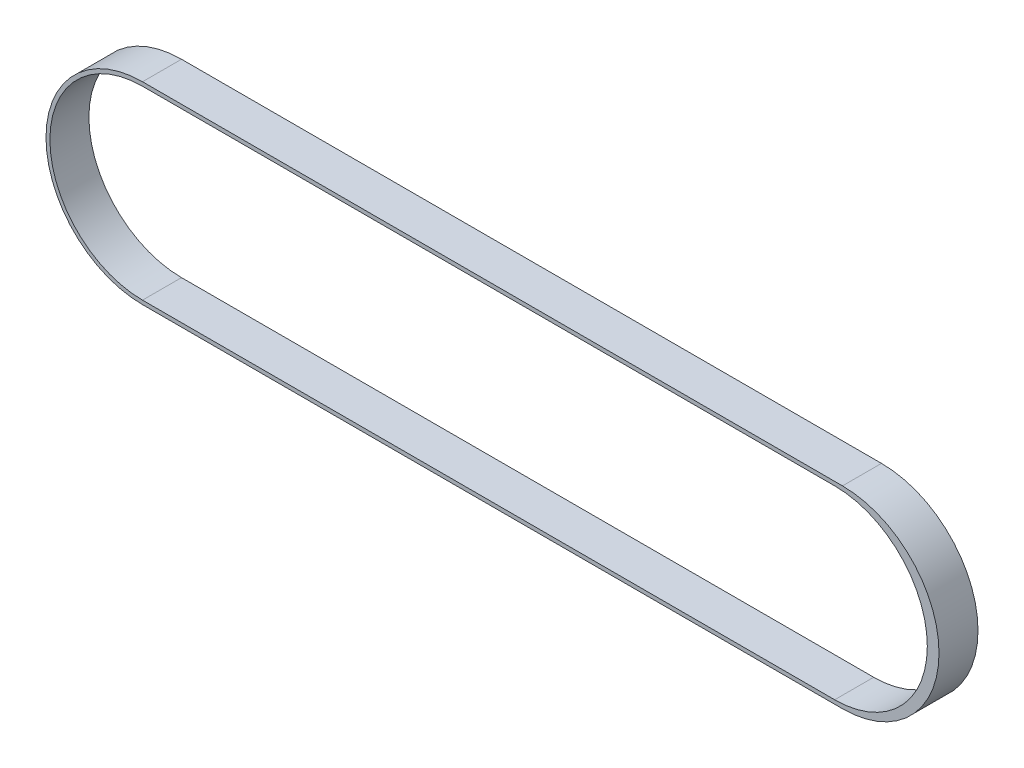
ISO-10303-21;
HEADER;
FILE_DESCRIPTION(('STEP AP214'),'2;1');
FILE_NAME('part.step','',(''),(''),'','','');
FILE_SCHEMA(('AUTOMOTIVE_DESIGN { 1 0 10303 214 1 1 1 1 }'));
ENDSEC;
DATA;
#1=APPLICATION_CONTEXT('core data for automotive mechanical design processes');
#2=APPLICATION_PROTOCOL_DEFINITION('international standard','automotive_design',2000,#1);
#3=PRODUCT_CONTEXT('',#1,'mechanical');
#4=PRODUCT('Part','Part','',(#3));
#5=PRODUCT_RELATED_PRODUCT_CATEGORY('part','',(#4));
#6=PRODUCT_DEFINITION_FORMATION('','',#4);
#7=PRODUCT_DEFINITION_CONTEXT('part definition',#1,'design');
#8=PRODUCT_DEFINITION('design','',#6,#7);
#9=PRODUCT_DEFINITION_SHAPE('','',#8);
#10=(LENGTH_UNIT() NAMED_UNIT(*) SI_UNIT(.MILLI.,.METRE.));
#11=(NAMED_UNIT(*) PLANE_ANGLE_UNIT() SI_UNIT($,.RADIAN.));
#12=(NAMED_UNIT(*) SI_UNIT($,.STERADIAN.) SOLID_ANGLE_UNIT());
#13=UNCERTAINTY_MEASURE_WITH_UNIT(LENGTH_MEASURE(1.E-05),#10,'distance_accuracy_value','');
#14=(GEOMETRIC_REPRESENTATION_CONTEXT(3) GLOBAL_UNCERTAINTY_ASSIGNED_CONTEXT((#13)) GLOBAL_UNIT_ASSIGNED_CONTEXT((#10,
#11,#12)) REPRESENTATION_CONTEXT('',''));
#15=CARTESIAN_POINT('',(0.,0.,0.));
#16=DIRECTION('',(0.,0.,1.));
#17=DIRECTION('',(1.,0.,0.));
#18=AXIS2_PLACEMENT_3D('',#15,#16,#17);
#19=CARTESIAN_POINT('',(0.,0.,12.7));
#20=DIRECTION('',(0.,0.,-1.));
#21=DIRECTION('',(-1.,0.,0.));
#22=AXIS2_PLACEMENT_3D('',#19,#20,#21);
#23=CYLINDRICAL_SURFACE('',#22,31.4325);
#24=CARTESIAN_POINT('',(0.,0.,0.));
#25=DIRECTION('',(0.,0.,1.));
#26=DIRECTION('',(1.,0.,0.));
#27=AXIS2_PLACEMENT_3D('',#24,#25,#26);
#28=CIRCLE('',#27,31.4325);
#29=CARTESIAN_POINT('',(0.,31.4325,0.));
#30=VERTEX_POINT('',#29);
#31=CARTESIAN_POINT('',(0.,-31.4325,0.));
#32=VERTEX_POINT('',#31);
#33=EDGE_CURVE('E147',#30,#32,#28,.T.);
#34=ORIENTED_EDGE('',*,*,#33,.T.);
#35=DIRECTION('',(0.,0.,-1.));
#36=VECTOR('',#35,1.);
#37=CARTESIAN_POINT('',(0.,-31.4325,12.7));
#38=LINE('',#37,#36);
#39=CARTESIAN_POINT('',(0.,-31.4325,12.7));
#40=VERTEX_POINT('',#39);
#41=EDGE_CURVE('E11',#40,#32,#38,.T.);
#42=ORIENTED_EDGE('',*,*,#41,.F.);
#43=CARTESIAN_POINT('',(0.,0.,12.7));
#44=DIRECTION('',(0.,0.,1.));
#45=DIRECTION('',(1.,0.,0.));
#46=AXIS2_PLACEMENT_3D('',#43,#44,#45);
#47=CIRCLE('',#46,31.4325);
#48=CARTESIAN_POINT('',(0.,31.4325,12.7));
#49=VERTEX_POINT('',#48);
#50=EDGE_CURVE('E153',#49,#40,#47,.T.);
#51=ORIENTED_EDGE('',*,*,#50,.F.);
#52=DIRECTION('',(0.,0.,-1.));
#53=VECTOR('',#52,1.);
#54=CARTESIAN_POINT('',(0.,31.4325,12.7));
#55=LINE('',#54,#53);
#56=EDGE_CURVE('E167',#49,#30,#55,.T.);
#57=ORIENTED_EDGE('',*,*,#56,.T.);
#58=EDGE_LOOP('',(#34,#42,#51,#57));
#59=FACE_BOUND('',#58,.T.);
#60=ADVANCED_FACE('F39',(#59),#23,.T.);
#61=CARTESIAN_POINT('',(0.,-31.4325,12.7));
#62=DIRECTION('',(0.,1.,0.));
#63=DIRECTION('',(0.,0.,1.));
#64=AXIS2_PLACEMENT_3D('',#61,#62,#63);
#65=PLANE('',#64);
#66=DIRECTION('',(1.,0.,0.));
#67=VECTOR('',#66,1.);
#68=CARTESIAN_POINT('',(0.,-31.4325,0.));
#69=LINE('',#68,#67);
#70=CARTESIAN_POINT('',(227.965,-31.4325,0.));
#71=VERTEX_POINT('',#70);
#72=EDGE_CURVE('E171',#32,#71,#69,.T.);
#73=ORIENTED_EDGE('',*,*,#72,.T.);
#74=DIRECTION('',(0.,0.,-1.));
#75=VECTOR('',#74,1.);
#76=CARTESIAN_POINT('',(227.965,-31.4325,12.7));
#77=LINE('',#76,#75);
#78=CARTESIAN_POINT('',(227.965,-31.4325,12.7));
#79=VERTEX_POINT('',#78);
#80=EDGE_CURVE('E47',#79,#71,#77,.T.);
#81=ORIENTED_EDGE('',*,*,#80,.F.);
#82=DIRECTION('',(1.,0.,0.));
#83=VECTOR('',#82,1.);
#84=CARTESIAN_POINT('',(0.,-31.4325,12.7));
#85=LINE('',#84,#83);
#86=EDGE_CURVE('E157',#40,#79,#85,.T.);
#87=ORIENTED_EDGE('',*,*,#86,.F.);
#88=ORIENTED_EDGE('',*,*,#41,.T.);
#89=EDGE_LOOP('',(#73,#81,#87,#88));
#90=FACE_BOUND('',#89,.T.);
#91=ADVANCED_FACE('F205',(#90),#65,.F.);
#92=CARTESIAN_POINT('',(227.965,0.,12.7));
#93=DIRECTION('',(0.,0.,-1.));
#94=DIRECTION('',(-1.,0.,0.));
#95=AXIS2_PLACEMENT_3D('',#92,#93,#94);
#96=CYLINDRICAL_SURFACE('',#95,31.4325);
#97=CARTESIAN_POINT('',(227.965,0.,0.));
#98=DIRECTION('',(0.,0.,1.));
#99=DIRECTION('',(1.,0.,0.));
#100=AXIS2_PLACEMENT_3D('',#97,#98,#99);
#101=CIRCLE('',#100,31.4325);
#102=CARTESIAN_POINT('',(227.965,31.4325,0.));
#103=VERTEX_POINT('',#102);
#104=EDGE_CURVE('E174',#71,#103,#101,.T.);
#105=ORIENTED_EDGE('',*,*,#104,.T.);
#106=DIRECTION('',(0.,0.,-1.));
#107=VECTOR('',#106,1.);
#108=CARTESIAN_POINT('',(227.965,31.4325,12.7));
#109=LINE('',#108,#107);
#110=CARTESIAN_POINT('',(227.965,31.4325,12.7));
#111=VERTEX_POINT('',#110);
#112=EDGE_CURVE('E182',#111,#103,#109,.T.);
#113=ORIENTED_EDGE('',*,*,#112,.F.);
#114=CARTESIAN_POINT('',(227.965,0.,12.7));
#115=DIRECTION('',(0.,0.,1.));
#116=DIRECTION('',(1.,0.,0.));
#117=AXIS2_PLACEMENT_3D('',#114,#115,#116);
#118=CIRCLE('',#117,31.4325);
#119=EDGE_CURVE('E161',#79,#111,#118,.T.);
#120=ORIENTED_EDGE('',*,*,#119,.F.);
#121=ORIENTED_EDGE('',*,*,#80,.T.);
#122=EDGE_LOOP('',(#105,#113,#120,#121));
#123=FACE_BOUND('',#122,.T.);
#124=ADVANCED_FACE('F191',(#123),#96,.T.);
#125=CARTESIAN_POINT('',(0.,31.4325,12.7));
#126=DIRECTION('',(0.,-1.,0.));
#127=DIRECTION('',(0.,0.,-1.));
#128=AXIS2_PLACEMENT_3D('',#125,#126,#127);
#129=PLANE('',#128);
#130=DIRECTION('',(-1.,0.,0.));
#131=VECTOR('',#130,1.);
#132=CARTESIAN_POINT('',(0.,31.4325,0.));
#133=LINE('',#132,#131);
#134=EDGE_CURVE('E158',#103,#30,#133,.T.);
#135=ORIENTED_EDGE('',*,*,#134,.T.);
#136=ORIENTED_EDGE('',*,*,#56,.F.);
#137=DIRECTION('',(-1.,0.,0.));
#138=VECTOR('',#137,1.);
#139=CARTESIAN_POINT('',(0.,31.4325,12.7));
#140=LINE('',#139,#138);
#141=EDGE_CURVE('E164',#111,#49,#140,.T.);
#142=ORIENTED_EDGE('',*,*,#141,.F.);
#143=ORIENTED_EDGE('',*,*,#112,.T.);
#144=EDGE_LOOP('',(#135,#136,#142,#143));
#145=FACE_BOUND('',#144,.T.);
#146=ADVANCED_FACE('F198',(#145),#129,.F.);
#147=CARTESIAN_POINT('',(0.,0.,12.7));
#148=DIRECTION('',(0.,0.,1.));
#149=DIRECTION('',(1.,0.,0.));
#150=AXIS2_PLACEMENT_3D('',#147,#148,#149);
#151=PLANE('',#150);
#152=CARTESIAN_POINT('',(0.,0.,12.7));
#153=DIRECTION('',(0.,0.,1.));
#154=DIRECTION('',(1.,0.,0.));
#155=AXIS2_PLACEMENT_3D('',#152,#153,#154);
#156=CIRCLE('',#155,30.1625);
#157=CARTESIAN_POINT('',(0.,30.1625,12.7));
#158=VERTEX_POINT('',#157);
#159=CARTESIAN_POINT('',(0.,-30.1625,12.7));
#160=VERTEX_POINT('',#159);
#161=EDGE_CURVE('E54',#158,#160,#156,.T.);
#162=ORIENTED_EDGE('',*,*,#161,.F.);
#163=DIRECTION('',(-1.,0.,0.));
#164=VECTOR('',#163,1.);
#165=CARTESIAN_POINT('',(0.,30.1625,12.7));
#166=LINE('',#165,#164);
#167=CARTESIAN_POINT('',(225.425,30.1625,12.7));
#168=VERTEX_POINT('',#167);
#169=EDGE_CURVE('E125',#168,#158,#166,.T.);
#170=ORIENTED_EDGE('',*,*,#169,.F.);
#171=CARTESIAN_POINT('',(225.425,0.,12.7));
#172=DIRECTION('',(0.,0.,1.));
#173=DIRECTION('',(1.,0.,0.));
#174=AXIS2_PLACEMENT_3D('',#171,#172,#173);
#175=CIRCLE('',#174,30.1625);
#176=CARTESIAN_POINT('',(225.425,-30.1625,12.7));
#177=VERTEX_POINT('',#176);
#178=EDGE_CURVE('E129',#177,#168,#175,.T.);
#179=ORIENTED_EDGE('',*,*,#178,.F.);
#180=DIRECTION('',(1.,0.,0.));
#181=VECTOR('',#180,1.);
#182=CARTESIAN_POINT('',(0.,-30.1625,12.7));
#183=LINE('',#182,#181);
#184=EDGE_CURVE('E138',#160,#177,#183,.T.);
#185=ORIENTED_EDGE('',*,*,#184,.F.);
#186=EDGE_LOOP('',(#162,#170,#179,#185));
#187=FACE_BOUND('',#186,.T.);
#188=ORIENTED_EDGE('',*,*,#50,.T.);
#189=ORIENTED_EDGE('',*,*,#86,.T.);
#190=ORIENTED_EDGE('',*,*,#119,.T.);
#191=ORIENTED_EDGE('',*,*,#141,.T.);
#192=EDGE_LOOP('',(#188,#189,#190,#191));
#193=FACE_BOUND('',#192,.T.);
#194=ADVANCED_FACE('F204',(#187,#193),#151,.T.);
#195=CARTESIAN_POINT('',(0.,0.,0.));
#196=DIRECTION('',(0.,0.,1.));
#197=DIRECTION('',(1.,0.,0.));
#198=AXIS2_PLACEMENT_3D('',#195,#196,#197);
#199=PLANE('',#198);
#200=DIRECTION('',(-1.,0.,0.));
#201=VECTOR('',#200,1.);
#202=CARTESIAN_POINT('',(0.,30.1625,0.));
#203=LINE('',#202,#201);
#204=CARTESIAN_POINT('',(225.425,30.1625,0.));
#205=VERTEX_POINT('',#204);
#206=CARTESIAN_POINT('',(0.,30.1625,0.));
#207=VERTEX_POINT('',#206);
#208=EDGE_CURVE('E113',#205,#207,#203,.T.);
#209=ORIENTED_EDGE('',*,*,#208,.T.);
#210=CARTESIAN_POINT('',(0.,0.,0.));
#211=DIRECTION('',(0.,0.,1.));
#212=DIRECTION('',(1.,0.,0.));
#213=AXIS2_PLACEMENT_3D('',#210,#211,#212);
#214=CIRCLE('',#213,30.1625);
#215=CARTESIAN_POINT('',(0.,-30.1625,0.));
#216=VERTEX_POINT('',#215);
#217=EDGE_CURVE('E106',#207,#216,#214,.T.);
#218=ORIENTED_EDGE('',*,*,#217,.T.);
#219=DIRECTION('',(1.,0.,0.));
#220=VECTOR('',#219,1.);
#221=CARTESIAN_POINT('',(0.,-30.1625,0.));
#222=LINE('',#221,#220);
#223=CARTESIAN_POINT('',(225.425,-30.1625,0.));
#224=VERTEX_POINT('',#223);
#225=EDGE_CURVE('E116',#216,#224,#222,.T.);
#226=ORIENTED_EDGE('',*,*,#225,.T.);
#227=CARTESIAN_POINT('',(225.425,0.,0.));
#228=DIRECTION('',(0.,0.,1.));
#229=DIRECTION('',(1.,0.,0.));
#230=AXIS2_PLACEMENT_3D('',#227,#228,#229);
#231=CIRCLE('',#230,30.1625);
#232=EDGE_CURVE('E62',#224,#205,#231,.T.);
#233=ORIENTED_EDGE('',*,*,#232,.T.);
#234=EDGE_LOOP('',(#209,#218,#226,#233));
#235=FACE_BOUND('',#234,.T.);
#236=ORIENTED_EDGE('',*,*,#33,.F.);
#237=ORIENTED_EDGE('',*,*,#134,.F.);
#238=ORIENTED_EDGE('',*,*,#104,.F.);
#239=ORIENTED_EDGE('',*,*,#72,.F.);
#240=EDGE_LOOP('',(#236,#237,#238,#239));
#241=FACE_BOUND('',#240,.T.);
#242=ADVANCED_FACE('F121',(#235,#241),#199,.F.);
#243=CARTESIAN_POINT('',(0.,0.,0.));
#244=DIRECTION('',(0.,0.,1.));
#245=DIRECTION('',(1.,0.,0.));
#246=AXIS2_PLACEMENT_3D('',#243,#244,#245);
#247=CYLINDRICAL_SURFACE('',#246,30.1625);
#248=ORIENTED_EDGE('',*,*,#161,.T.);
#249=DIRECTION('',(0.,0.,1.));
#250=VECTOR('',#249,1.);
#251=CARTESIAN_POINT('',(0.,-30.1625,0.));
#252=LINE('',#251,#250);
#253=EDGE_CURVE('E102',#216,#160,#252,.T.);
#254=ORIENTED_EDGE('',*,*,#253,.F.);
#255=ORIENTED_EDGE('',*,*,#217,.F.);
#256=DIRECTION('',(0.,0.,1.));
#257=VECTOR('',#256,1.);
#258=CARTESIAN_POINT('',(0.,30.1625,0.));
#259=LINE('',#258,#257);
#260=EDGE_CURVE('E144',#207,#158,#259,.T.);
#261=ORIENTED_EDGE('',*,*,#260,.T.);
#262=EDGE_LOOP('',(#248,#254,#255,#261));
#263=FACE_BOUND('',#262,.T.);
#264=ADVANCED_FACE('F104',(#263),#247,.F.);
#265=CARTESIAN_POINT('',(0.,30.1625,0.));
#266=DIRECTION('',(0.,1.,0.));
#267=DIRECTION('',(0.,0.,1.));
#268=AXIS2_PLACEMENT_3D('',#265,#266,#267);
#269=PLANE('',#268);
#270=ORIENTED_EDGE('',*,*,#169,.T.);
#271=ORIENTED_EDGE('',*,*,#260,.F.);
#272=ORIENTED_EDGE('',*,*,#208,.F.);
#273=DIRECTION('',(0.,0.,1.));
#274=VECTOR('',#273,1.);
#275=CARTESIAN_POINT('',(225.425,30.1625,0.));
#276=LINE('',#275,#274);
#277=EDGE_CURVE('E148',#205,#168,#276,.T.);
#278=ORIENTED_EDGE('',*,*,#277,.T.);
#279=EDGE_LOOP('',(#270,#271,#272,#278));
#280=FACE_BOUND('',#279,.T.);
#281=ADVANCED_FACE('F222',(#280),#269,.F.);
#282=CARTESIAN_POINT('',(225.425,0.,0.));
#283=DIRECTION('',(0.,0.,1.));
#284=DIRECTION('',(1.,0.,0.));
#285=AXIS2_PLACEMENT_3D('',#282,#283,#284);
#286=CYLINDRICAL_SURFACE('',#285,30.1625);
#287=ORIENTED_EDGE('',*,*,#178,.T.);
#288=ORIENTED_EDGE('',*,*,#277,.F.);
#289=ORIENTED_EDGE('',*,*,#232,.F.);
#290=DIRECTION('',(0.,0.,1.));
#291=VECTOR('',#290,1.);
#292=CARTESIAN_POINT('',(225.425,-30.1625,0.));
#293=LINE('',#292,#291);
#294=EDGE_CURVE('E112',#224,#177,#293,.T.);
#295=ORIENTED_EDGE('',*,*,#294,.T.);
#296=EDGE_LOOP('',(#287,#288,#289,#295));
#297=FACE_BOUND('',#296,.T.);
#298=ADVANCED_FACE('F225',(#297),#286,.F.);
#299=CARTESIAN_POINT('',(0.,-30.1625,0.));
#300=DIRECTION('',(0.,-1.,0.));
#301=DIRECTION('',(0.,0.,-1.));
#302=AXIS2_PLACEMENT_3D('',#299,#300,#301);
#303=PLANE('',#302);
#304=ORIENTED_EDGE('',*,*,#184,.T.);
#305=ORIENTED_EDGE('',*,*,#294,.F.);
#306=ORIENTED_EDGE('',*,*,#225,.F.);
#307=ORIENTED_EDGE('',*,*,#253,.T.);
#308=EDGE_LOOP('',(#304,#305,#306,#307));
#309=FACE_BOUND('',#308,.T.);
#310=ADVANCED_FACE('F117',(#309),#303,.F.);
#311=CLOSED_SHELL('',(#60,#91,#124,#146,#194,#242,#264,#281,#298,#310));
#312=MANIFOLD_SOLID_BREP('B2',#311);
#313=ADVANCED_BREP_SHAPE_REPRESENTATION('',(#18,#312),#14);
#314=SHAPE_DEFINITION_REPRESENTATION(#9,#313);
ENDSEC;
END-ISO-10303-21;
